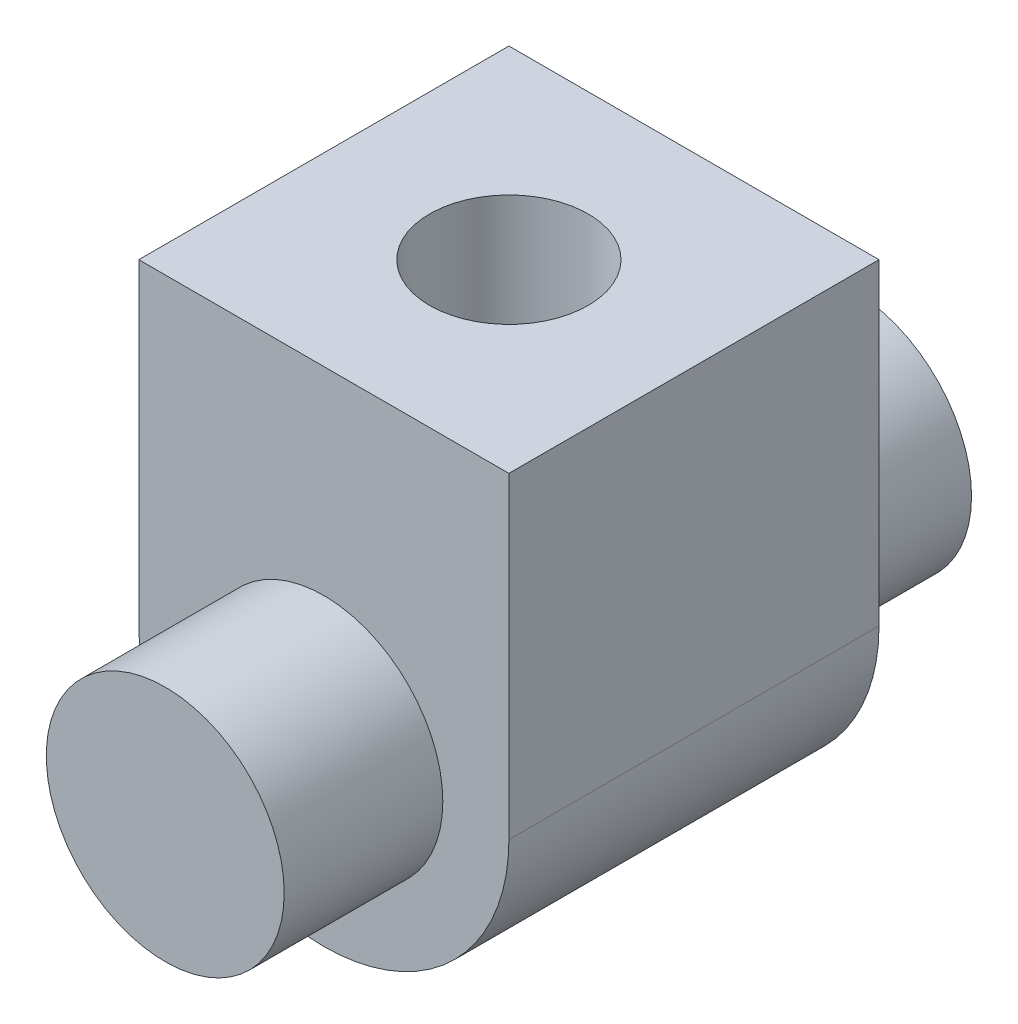
ISO-10303-21;
HEADER;
FILE_DESCRIPTION(('STEP AP214'),'2;1');
FILE_NAME('part.step','',(''),(''),'','','');
FILE_SCHEMA(('AUTOMOTIVE_DESIGN { 1 0 10303 214 1 1 1 1 }'));
ENDSEC;
DATA;
#1=APPLICATION_CONTEXT('core data for automotive mechanical design processes');
#2=APPLICATION_PROTOCOL_DEFINITION('international standard','automotive_design',2000,#1);
#3=PRODUCT_CONTEXT('',#1,'mechanical');
#4=PRODUCT('Part','Part','',(#3));
#5=PRODUCT_RELATED_PRODUCT_CATEGORY('part','',(#4));
#6=PRODUCT_DEFINITION_FORMATION('','',#4);
#7=PRODUCT_DEFINITION_CONTEXT('part definition',#1,'design');
#8=PRODUCT_DEFINITION('design','',#6,#7);
#9=PRODUCT_DEFINITION_SHAPE('','',#8);
#10=(LENGTH_UNIT() NAMED_UNIT(*) SI_UNIT(.MILLI.,.METRE.));
#11=(NAMED_UNIT(*) PLANE_ANGLE_UNIT() SI_UNIT($,.RADIAN.));
#12=(NAMED_UNIT(*) SI_UNIT($,.STERADIAN.) SOLID_ANGLE_UNIT());
#13=UNCERTAINTY_MEASURE_WITH_UNIT(LENGTH_MEASURE(1.E-05),#10,'distance_accuracy_value','');
#14=(GEOMETRIC_REPRESENTATION_CONTEXT(3) GLOBAL_UNCERTAINTY_ASSIGNED_CONTEXT((#13)) GLOBAL_UNIT_ASSIGNED_CONTEXT((#10,
#11,#12)) REPRESENTATION_CONTEXT('',''));
#15=CARTESIAN_POINT('',(0.,0.,0.));
#16=DIRECTION('',(0.,0.,1.));
#17=DIRECTION('',(1.,0.,0.));
#18=AXIS2_PLACEMENT_3D('',#15,#16,#17);
#19=CARTESIAN_POINT('',(0.,0.,0.));
#20=DIRECTION('',(0.,0.,1.));
#21=DIRECTION('',(1.,0.,0.));
#22=AXIS2_PLACEMENT_3D('',#19,#20,#21);
#23=PLANE('',#22);
#24=CARTESIAN_POINT('',(0.,0.,0.));
#25=DIRECTION('',(0.,0.,1.));
#26=DIRECTION('',(1.,0.,0.));
#27=AXIS2_PLACEMENT_3D('',#24,#25,#26);
#28=CIRCLE('',#27,3.5);
#29=CARTESIAN_POINT('',(-3.5,0.,0.));
#30=VERTEX_POINT('',#29);
#31=CARTESIAN_POINT('',(3.5,0.,0.));
#32=VERTEX_POINT('',#31);
#33=EDGE_CURVE('E99',#30,#32,#28,.T.);
#34=ORIENTED_EDGE('',*,*,#33,.F.);
#35=DIRECTION('',(0.,-1.,0.));
#36=VECTOR('',#35,1.);
#37=CARTESIAN_POINT('',(-3.5,0.,0.));
#38=LINE('',#37,#36);
#39=CARTESIAN_POINT('',(-3.5,6.,0.));
#40=VERTEX_POINT('',#39);
#41=EDGE_CURVE('E71',#40,#30,#38,.T.);
#42=ORIENTED_EDGE('',*,*,#41,.F.);
#43=DIRECTION('',(-1.,0.,0.));
#44=VECTOR('',#43,1.);
#45=CARTESIAN_POINT('',(-3.5,6.,0.));
#46=LINE('',#45,#44);
#47=CARTESIAN_POINT('',(3.5,6.,0.));
#48=VERTEX_POINT('',#47);
#49=EDGE_CURVE('E65',#48,#40,#46,.T.);
#50=ORIENTED_EDGE('',*,*,#49,.F.);
#51=DIRECTION('',(0.,1.,0.));
#52=VECTOR('',#51,1.);
#53=CARTESIAN_POINT('',(3.5,6.,0.));
#54=LINE('',#53,#52);
#55=EDGE_CURVE('E90',#32,#48,#54,.T.);
#56=ORIENTED_EDGE('',*,*,#55,.F.);
#57=EDGE_LOOP('',(#34,#42,#50,#56));
#58=FACE_BOUND('',#57,.T.);
#59=CARTESIAN_POINT('',(0.,0.,0.));
#60=DIRECTION('',(0.,0.,1.));
#61=DIRECTION('',(1.,0.,0.));
#62=AXIS2_PLACEMENT_3D('',#59,#60,#61);
#63=CIRCLE('',#62,2.25);
#64=CARTESIAN_POINT('',(2.25,0.,0.));
#65=VERTEX_POINT('',#64);
#66=EDGE_CURVE('E11',#65,#65,#63,.F.);
#67=ORIENTED_EDGE('',*,*,#66,.F.);
#68=EDGE_LOOP('',(#67));
#69=FACE_BOUND('',#68,.T.);
#70=ADVANCED_FACE('F31',(#58,#69),#23,.F.);
#71=CARTESIAN_POINT('',(0.,0.,7.));
#72=DIRECTION('',(0.,0.,1.));
#73=DIRECTION('',(1.,0.,0.));
#74=AXIS2_PLACEMENT_3D('',#71,#72,#73);
#75=PLANE('',#74);
#76=CARTESIAN_POINT('',(0.,0.,7.));
#77=DIRECTION('',(0.,0.,1.));
#78=DIRECTION('',(1.,0.,0.));
#79=AXIS2_PLACEMENT_3D('',#76,#77,#78);
#80=CIRCLE('',#79,3.5);
#81=CARTESIAN_POINT('',(-3.5,0.,7.));
#82=VERTEX_POINT('',#81);
#83=CARTESIAN_POINT('',(3.5,0.,7.));
#84=VERTEX_POINT('',#83);
#85=EDGE_CURVE('E85',#82,#84,#80,.T.);
#86=ORIENTED_EDGE('',*,*,#85,.T.);
#87=DIRECTION('',(0.,1.,0.));
#88=VECTOR('',#87,1.);
#89=CARTESIAN_POINT('',(3.5,6.,7.));
#90=LINE('',#89,#88);
#91=CARTESIAN_POINT('',(3.5,6.,7.));
#92=VERTEX_POINT('',#91);
#93=EDGE_CURVE('E79',#84,#92,#90,.T.);
#94=ORIENTED_EDGE('',*,*,#93,.T.);
#95=DIRECTION('',(-1.,0.,0.));
#96=VECTOR('',#95,1.);
#97=CARTESIAN_POINT('',(-3.5,6.,7.));
#98=LINE('',#97,#96);
#99=CARTESIAN_POINT('',(-3.5,6.,7.));
#100=VERTEX_POINT('',#99);
#101=EDGE_CURVE('E83',#92,#100,#98,.T.);
#102=ORIENTED_EDGE('',*,*,#101,.T.);
#103=DIRECTION('',(0.,-1.,0.));
#104=VECTOR('',#103,1.);
#105=CARTESIAN_POINT('',(-3.5,0.,7.));
#106=LINE('',#105,#104);
#107=EDGE_CURVE('E48',#100,#82,#106,.T.);
#108=ORIENTED_EDGE('',*,*,#107,.T.);
#109=EDGE_LOOP('',(#86,#94,#102,#108));
#110=FACE_BOUND('',#109,.T.);
#111=CARTESIAN_POINT('',(0.,0.,7.));
#112=DIRECTION('',(0.,0.,1.));
#113=DIRECTION('',(1.,0.,0.));
#114=AXIS2_PLACEMENT_3D('',#111,#112,#113);
#115=CIRCLE('',#114,2.25);
#116=CARTESIAN_POINT('',(2.25,0.,7.));
#117=VERTEX_POINT('',#116);
#118=EDGE_CURVE('E210',#117,#117,#115,.T.);
#119=ORIENTED_EDGE('',*,*,#118,.F.);
#120=EDGE_LOOP('',(#119));
#121=FACE_BOUND('',#120,.T.);
#122=ADVANCED_FACE('F80',(#110,#121),#75,.T.);
#123=CARTESIAN_POINT('',(0.,0.,7.));
#124=DIRECTION('',(0.,0.,-1.));
#125=DIRECTION('',(-1.,0.,0.));
#126=AXIS2_PLACEMENT_3D('',#123,#124,#125);
#127=CYLINDRICAL_SURFACE('',#126,3.5);
#128=ORIENTED_EDGE('',*,*,#33,.T.);
#129=DIRECTION('',(0.,0.,-1.));
#130=VECTOR('',#129,1.);
#131=CARTESIAN_POINT('',(3.5,0.,7.));
#132=LINE('',#131,#130);
#133=EDGE_CURVE('E40',#84,#32,#132,.T.);
#134=ORIENTED_EDGE('',*,*,#133,.F.);
#135=ORIENTED_EDGE('',*,*,#85,.F.);
#136=DIRECTION('',(0.,0.,-1.));
#137=VECTOR('',#136,1.);
#138=CARTESIAN_POINT('',(-3.5,0.,7.));
#139=LINE('',#138,#137);
#140=EDGE_CURVE('E95',#82,#30,#139,.T.);
#141=ORIENTED_EDGE('',*,*,#140,.T.);
#142=EDGE_LOOP('',(#128,#134,#135,#141));
#143=FACE_BOUND('',#142,.T.);
#144=ADVANCED_FACE('F33',(#143),#127,.T.);
#145=CARTESIAN_POINT('',(3.5,6.,7.));
#146=DIRECTION('',(-1.,0.,0.));
#147=DIRECTION('',(0.,-1.,0.));
#148=AXIS2_PLACEMENT_3D('',#145,#146,#147);
#149=PLANE('',#148);
#150=ORIENTED_EDGE('',*,*,#55,.T.);
#151=DIRECTION('',(0.,0.,-1.));
#152=VECTOR('',#151,1.);
#153=CARTESIAN_POINT('',(3.5,6.,7.));
#154=LINE('',#153,#152);
#155=EDGE_CURVE('E88',#92,#48,#154,.T.);
#156=ORIENTED_EDGE('',*,*,#155,.F.);
#157=ORIENTED_EDGE('',*,*,#93,.F.);
#158=ORIENTED_EDGE('',*,*,#133,.T.);
#159=EDGE_LOOP('',(#150,#156,#157,#158));
#160=FACE_BOUND('',#159,.T.);
#161=ADVANCED_FACE('F89',(#160),#149,.F.);
#162=CARTESIAN_POINT('',(-3.5,6.,7.));
#163=DIRECTION('',(0.,-1.,0.));
#164=DIRECTION('',(0.,0.,-1.));
#165=AXIS2_PLACEMENT_3D('',#162,#163,#164);
#166=PLANE('',#165);
#167=CARTESIAN_POINT('',(0.,6.,3.5));
#168=DIRECTION('',(0.,1.,0.));
#169=DIRECTION('',(0.,0.,1.));
#170=AXIS2_PLACEMENT_3D('',#167,#168,#169);
#171=CIRCLE('',#170,1.5);
#172=CARTESIAN_POINT('',(0.,6.,5.));
#173=VERTEX_POINT('',#172);
#174=EDGE_CURVE('E207',#173,#173,#171,.T.);
#175=ORIENTED_EDGE('',*,*,#174,.F.);
#176=EDGE_LOOP('',(#175));
#177=FACE_BOUND('',#176,.T.);
#178=ORIENTED_EDGE('',*,*,#49,.T.);
#179=DIRECTION('',(0.,0.,-1.));
#180=VECTOR('',#179,1.);
#181=CARTESIAN_POINT('',(-3.5,6.,7.));
#182=LINE('',#181,#180);
#183=EDGE_CURVE('E91',#100,#40,#182,.T.);
#184=ORIENTED_EDGE('',*,*,#183,.F.);
#185=ORIENTED_EDGE('',*,*,#101,.F.);
#186=ORIENTED_EDGE('',*,*,#155,.T.);
#187=EDGE_LOOP('',(#178,#184,#185,#186));
#188=FACE_BOUND('',#187,.T.);
#189=ADVANCED_FACE('F93',(#177,#188),#166,.F.);
#190=CARTESIAN_POINT('',(-3.5,0.,7.));
#191=DIRECTION('',(1.,0.,0.));
#192=DIRECTION('',(0.,1.,0.));
#193=AXIS2_PLACEMENT_3D('',#190,#191,#192);
#194=PLANE('',#193);
#195=ORIENTED_EDGE('',*,*,#41,.T.);
#196=ORIENTED_EDGE('',*,*,#140,.F.);
#197=ORIENTED_EDGE('',*,*,#107,.F.);
#198=ORIENTED_EDGE('',*,*,#183,.T.);
#199=EDGE_LOOP('',(#195,#196,#197,#198));
#200=FACE_BOUND('',#199,.T.);
#201=ADVANCED_FACE('F136',(#200),#194,.F.);
#202=CARTESIAN_POINT('',(0.,0.,10.));
#203=DIRECTION('',(0.,0.,-1.));
#204=DIRECTION('',(-1.,0.,0.));
#205=AXIS2_PLACEMENT_3D('',#202,#203,#204);
#206=CYLINDRICAL_SURFACE('',#205,2.25);
#207=CARTESIAN_POINT('',(0.,0.,10.));
#208=DIRECTION('',(0.,0.,1.));
#209=DIRECTION('',(1.,0.,0.));
#210=AXIS2_PLACEMENT_3D('',#207,#208,#209);
#211=CIRCLE('',#210,2.25);
#212=CARTESIAN_POINT('',(2.25,0.,10.));
#213=VERTEX_POINT('',#212);
#214=EDGE_CURVE('E102',#213,#213,#211,.T.);
#215=ORIENTED_EDGE('',*,*,#214,.F.);
#216=EDGE_LOOP('',(#215));
#217=FACE_BOUND('',#216,.T.);
#218=ORIENTED_EDGE('',*,*,#118,.T.);
#219=EDGE_LOOP('',(#218));
#220=FACE_BOUND('',#219,.T.);
#221=ADVANCED_FACE('F128',(#217,#220),#206,.T.);
#222=CARTESIAN_POINT('',(0.,0.,10.));
#223=DIRECTION('',(0.,0.,1.));
#224=DIRECTION('',(1.,0.,0.));
#225=AXIS2_PLACEMENT_3D('',#222,#223,#224);
#226=PLANE('',#225);
#227=ORIENTED_EDGE('',*,*,#214,.T.);
#228=EDGE_LOOP('',(#227));
#229=FACE_BOUND('',#228,.T.);
#230=ADVANCED_FACE('F118',(#229),#226,.T.);
#231=CARTESIAN_POINT('',(0.,0.,-3.));
#232=DIRECTION('',(0.,0.,1.));
#233=DIRECTION('',(1.,0.,0.));
#234=AXIS2_PLACEMENT_3D('',#231,#232,#233);
#235=CYLINDRICAL_SURFACE('',#234,2.25);
#236=CARTESIAN_POINT('',(0.,0.,-3.));
#237=DIRECTION('',(0.,0.,-1.));
#238=DIRECTION('',(-1.,0.,0.));
#239=AXIS2_PLACEMENT_3D('',#236,#237,#238);
#240=CIRCLE('',#239,2.25);
#241=CARTESIAN_POINT('',(-2.25,0.,-3.));
#242=VERTEX_POINT('',#241);
#243=EDGE_CURVE('E206',#242,#242,#240,.T.);
#244=ORIENTED_EDGE('',*,*,#243,.F.);
#245=EDGE_LOOP('',(#244));
#246=FACE_BOUND('',#245,.T.);
#247=ORIENTED_EDGE('',*,*,#66,.T.);
#248=EDGE_LOOP('',(#247));
#249=FACE_BOUND('',#248,.T.);
#250=ADVANCED_FACE('F115',(#246,#249),#235,.T.);
#251=CARTESIAN_POINT('',(0.,0.,-3.));
#252=DIRECTION('',(0.,0.,-1.));
#253=DIRECTION('',(-1.,0.,0.));
#254=AXIS2_PLACEMENT_3D('',#251,#252,#253);
#255=PLANE('',#254);
#256=ORIENTED_EDGE('',*,*,#243,.T.);
#257=EDGE_LOOP('',(#256));
#258=FACE_BOUND('',#257,.T.);
#259=ADVANCED_FACE('F117',(#258),#255,.T.);
#260=CARTESIAN_POINT('',(0.,1.,3.5));
#261=DIRECTION('',(0.,1.,0.));
#262=DIRECTION('',(0.,0.,1.));
#263=AXIS2_PLACEMENT_3D('',#260,#261,#262);
#264=CYLINDRICAL_SURFACE('',#263,1.5);
#265=CARTESIAN_POINT('',(0.,1.,3.5));
#266=DIRECTION('',(0.,1.,0.));
#267=DIRECTION('',(0.,0.,1.));
#268=AXIS2_PLACEMENT_3D('',#265,#266,#267);
#269=CIRCLE('',#268,1.5);
#270=CARTESIAN_POINT('',(0.,1.,5.));
#271=VERTEX_POINT('',#270);
#272=EDGE_CURVE('E205',#271,#271,#269,.T.);
#273=ORIENTED_EDGE('',*,*,#272,.F.);
#274=EDGE_LOOP('',(#273));
#275=FACE_BOUND('',#274,.T.);
#276=ORIENTED_EDGE('',*,*,#174,.T.);
#277=EDGE_LOOP('',(#276));
#278=FACE_BOUND('',#277,.T.);
#279=ADVANCED_FACE('F125',(#275,#278),#264,.F.);
#280=CARTESIAN_POINT('',(0.,1.,3.5));
#281=DIRECTION('',(0.,1.,0.));
#282=DIRECTION('',(0.,0.,1.));
#283=AXIS2_PLACEMENT_3D('',#280,#281,#282);
#284=PLANE('',#283);
#285=ORIENTED_EDGE('',*,*,#272,.T.);
#286=EDGE_LOOP('',(#285));
#287=FACE_BOUND('',#286,.T.);
#288=ADVANCED_FACE('F190',(#287),#284,.T.);
#289=CLOSED_SHELL('',(#70,#122,#144,#161,#189,#201,#221,#230,#250,#259,#279,#288));
#290=MANIFOLD_SOLID_BREP('B2',#289);
#291=ADVANCED_BREP_SHAPE_REPRESENTATION('',(#18,#290),#14);
#292=SHAPE_DEFINITION_REPRESENTATION(#9,#291);
ENDSEC;
END-ISO-10303-21;
